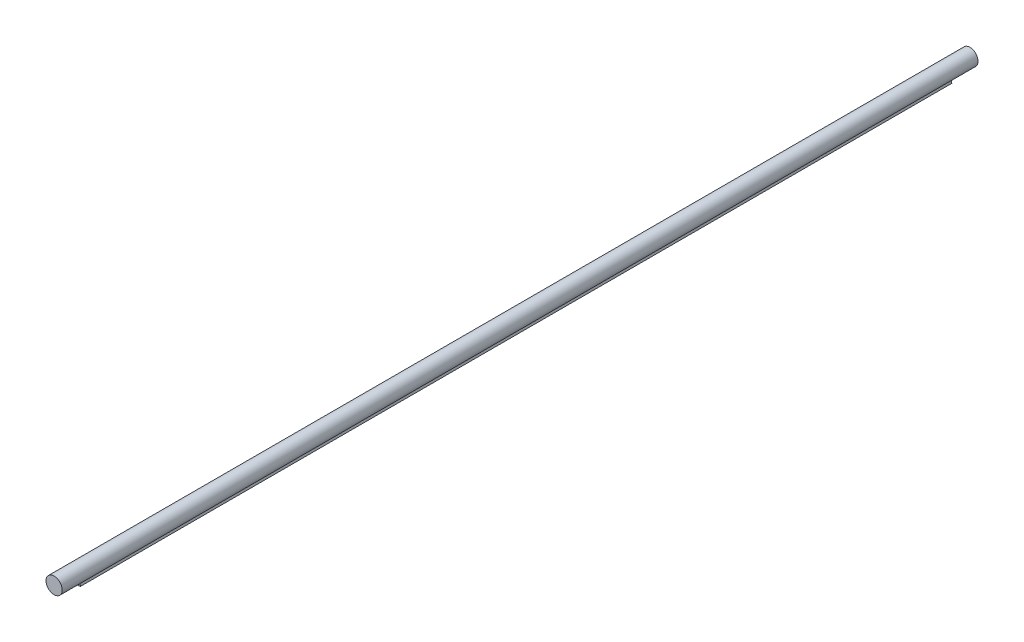
ISO-10303-21;
HEADER;
FILE_DESCRIPTION(('STEP AP214'),'2;1');
FILE_NAME('part.step','',(''),(''),'','','');
FILE_SCHEMA(('AUTOMOTIVE_DESIGN { 1 0 10303 214 1 1 1 1 }'));
ENDSEC;
DATA;
#1=APPLICATION_CONTEXT('core data for automotive mechanical design processes');
#2=APPLICATION_PROTOCOL_DEFINITION('international standard','automotive_design',2000,#1);
#3=PRODUCT_CONTEXT('',#1,'mechanical');
#4=PRODUCT('Part','Part','',(#3));
#5=PRODUCT_RELATED_PRODUCT_CATEGORY('part','',(#4));
#6=PRODUCT_DEFINITION_FORMATION('','',#4);
#7=PRODUCT_DEFINITION_CONTEXT('part definition',#1,'design');
#8=PRODUCT_DEFINITION('design','',#6,#7);
#9=PRODUCT_DEFINITION_SHAPE('','',#8);
#10=(LENGTH_UNIT() NAMED_UNIT(*) SI_UNIT(.MILLI.,.METRE.));
#11=(NAMED_UNIT(*) PLANE_ANGLE_UNIT() SI_UNIT($,.RADIAN.));
#12=(NAMED_UNIT(*) SI_UNIT($,.STERADIAN.) SOLID_ANGLE_UNIT());
#13=UNCERTAINTY_MEASURE_WITH_UNIT(LENGTH_MEASURE(1.E-05),#10,'distance_accuracy_value','');
#14=(GEOMETRIC_REPRESENTATION_CONTEXT(3) GLOBAL_UNCERTAINTY_ASSIGNED_CONTEXT((#13)) GLOBAL_UNIT_ASSIGNED_CONTEXT((#10,
#11,#12)) REPRESENTATION_CONTEXT('',''));
#15=CARTESIAN_POINT('',(0.,0.,0.));
#16=DIRECTION('',(0.,0.,1.));
#17=DIRECTION('',(1.,0.,0.));
#18=AXIS2_PLACEMENT_3D('',#15,#16,#17);
#19=CARTESIAN_POINT('',(2.34925514240952,0.389039636055203,854.446669897988));
#20=DIRECTION('',(0.986563839326466,0.163376225116821,0.));
#21=DIRECTION('',(-0.163376225116821,0.986563839326467,0.));
#22=AXIS2_PLACEMENT_3D('',#19,#20,#21);
#23=PLANE('',#22);
#24=DIRECTION('',(0.,0.,-1.));
#25=VECTOR('',#24,1.);
#26=CARTESIAN_POINT('',(4.03509356533366,-9.79106598099443,854.446669897988));
#27=LINE('',#26,#25);
#28=CARTESIAN_POINT('',(4.03509356528277,-9.79106598100286,808.2359375));
#29=VERTEX_POINT('',#28);
#30=CARTESIAN_POINT('',(4.03509356528277,-9.79106598100286,-46.2359375000004));
#31=VERTEX_POINT('',#30);
#32=EDGE_CURVE('E129',#29,#31,#27,.T.);
#33=ORIENTED_EDGE('',*,*,#32,.T.);
#34=DIRECTION('',(-0.163376225116821,0.986563839326467,0.));
#35=VECTOR('',#34,1.);
#36=CARTESIAN_POINT('',(2.34925514240952,0.389039636055203,-46.2359375000003));
#37=LINE('',#36,#35);
#38=CARTESIAN_POINT('',(3.58632234154447,-7.0811156121409,-46.2359375000004));
#39=VERTEX_POINT('',#38);
#40=EDGE_CURVE('E108',#31,#39,#37,.T.);
#41=ORIENTED_EDGE('',*,*,#40,.T.);
#42=DIRECTION('',(0.,0.,-1.));
#43=VECTOR('',#42,1.);
#44=CARTESIAN_POINT('',(3.58632234154971,-7.08111561215124,854.446669897988));
#45=LINE('',#44,#43);
#46=CARTESIAN_POINT('',(3.58632234154447,-7.0811156121409,808.2359375));
#47=VERTEX_POINT('',#46);
#48=EDGE_CURVE('E13',#47,#39,#45,.T.);
#49=ORIENTED_EDGE('',*,*,#48,.F.);
#50=DIRECTION('',(0.163376225116821,-0.986563839326467,0.));
#51=VECTOR('',#50,1.);
#52=CARTESIAN_POINT('',(2.34925514240952,0.389039636055203,808.2359375));
#53=LINE('',#52,#51);
#54=EDGE_CURVE('E80',#47,#29,#53,.T.);
#55=ORIENTED_EDGE('',*,*,#54,.T.);
#56=EDGE_LOOP('',(#33,#41,#49,#55));
#57=FACE_BOUND('',#56,.T.);
#58=ADVANCED_FACE('F59',(#57),#23,.T.);
#59=CARTESIAN_POINT('',(1.68583842293152,-10.1801056170549,854.446669897988));
#60=DIRECTION('',(0.16337622511682,-0.986563839326467,0.));
#61=DIRECTION('',(0.986563839326467,0.16337622511682,0.));
#62=AXIS2_PLACEMENT_3D('',#59,#60,#61);
#63=PLANE('',#62);
#64=DIRECTION('',(0.,0.,-1.));
#65=VECTOR('',#64,1.);
#66=CARTESIAN_POINT('',(-0.663416719458633,-10.5691452531133,854.446669897988));
#67=LINE('',#66,#65);
#68=CARTESIAN_POINT('',(-0.663416719460579,-10.5691452531016,808.2359375));
#69=VERTEX_POINT('',#68);
#70=CARTESIAN_POINT('',(-0.663416719460579,-10.5691452531016,-46.2359375000004));
#71=VERTEX_POINT('',#70);
#72=EDGE_CURVE('E119',#69,#71,#67,.T.);
#73=ORIENTED_EDGE('',*,*,#72,.T.);
#74=DIRECTION('',(0.986563839326467,0.16337622511682,0.));
#75=VECTOR('',#74,1.);
#76=CARTESIAN_POINT('',(1.68583842293151,-10.1801056170549,-46.2359375000003));
#77=LINE('',#76,#75);
#78=EDGE_CURVE('E102',#71,#31,#77,.T.);
#79=ORIENTED_EDGE('',*,*,#78,.T.);
#80=ORIENTED_EDGE('',*,*,#32,.F.);
#81=DIRECTION('',(-0.986563839326467,-0.16337622511682,0.));
#82=VECTOR('',#81,1.);
#83=CARTESIAN_POINT('',(1.68583842293152,-10.1801056170549,808.2359375));
#84=LINE('',#83,#82);
#85=EDGE_CURVE('E127',#29,#69,#84,.T.);
#86=ORIENTED_EDGE('',*,*,#85,.T.);
#87=EDGE_LOOP('',(#73,#79,#80,#86));
#88=FACE_BOUND('',#87,.T.);
#89=ADVANCED_FACE('F126',(#88),#63,.T.);
#90=CARTESIAN_POINT('',(-2.34925514238277,-0.389039636063656,854.446669897988));
#91=DIRECTION('',(-0.986563839326466,-0.163376225116821,0.));
#92=DIRECTION('',(0.163376225116821,-0.986563839326467,0.));
#93=AXIS2_PLACEMENT_3D('',#90,#91,#92);
#94=PLANE('',#93);
#95=DIRECTION('',(0.,0.,-1.));
#96=VECTOR('',#95,1.);
#97=CARTESIAN_POINT('',(-1.11218794324259,-7.8591948842701,854.446669897988));
#98=LINE('',#97,#96);
#99=CARTESIAN_POINT('',(-1.11218794324259,-7.8591948842701,808.2359375));
#100=VERTEX_POINT('',#99);
#101=CARTESIAN_POINT('',(-1.11218794324097,-7.85919488425862,-46.2359375000004));
#102=VERTEX_POINT('',#101);
#103=EDGE_CURVE('E121',#100,#102,#98,.T.);
#104=ORIENTED_EDGE('',*,*,#103,.T.);
#105=DIRECTION('',(0.163376225116821,-0.986563839326467,0.));
#106=VECTOR('',#105,1.);
#107=CARTESIAN_POINT('',(-2.34925514238277,-0.389039636063656,-46.2359375000003));
#108=LINE('',#107,#106);
#109=EDGE_CURVE('E105',#102,#71,#108,.T.);
#110=ORIENTED_EDGE('',*,*,#109,.T.);
#111=ORIENTED_EDGE('',*,*,#72,.F.);
#112=DIRECTION('',(-0.163376225116821,0.986563839326467,0.));
#113=VECTOR('',#112,1.);
#114=CARTESIAN_POINT('',(-2.34925514238277,-0.389039636063656,808.2359375));
#115=LINE('',#114,#113);
#116=EDGE_CURVE('E148',#69,#100,#115,.T.);
#117=ORIENTED_EDGE('',*,*,#116,.T.);
#118=EDGE_LOOP('',(#104,#110,#111,#117));
#119=FACE_BOUND('',#118,.T.);
#120=ADVANCED_FACE('F118',(#119),#94,.T.);
#121=CARTESIAN_POINT('',(1.33222426146329E-11,-3.88578058618805E-12,-68.0640625000004));
#122=DIRECTION('',(0.,0.,-1.));
#123=DIRECTION('',(-1.,0.,0.));
#124=AXIS2_PLACEMENT_3D('',#121,#122,#123);
#125=PLANE('',#124);
#126=CARTESIAN_POINT('',(1.33222426146329E-11,-3.88578058618805E-12,-68.0640625000004));
#127=DIRECTION('',(0.,0.,-1.));
#128=DIRECTION('',(-1.,0.,0.));
#129=AXIS2_PLACEMENT_3D('',#126,#127,#128);
#130=CIRCLE('',#129,7.9375);
#131=CARTESIAN_POINT('',(-7.93749999998668,-3.88578058618805E-12,-68.0640625000004));
#132=VERTEX_POINT('',#131);
#133=EDGE_CURVE('E136',#132,#132,#130,.T.);
#134=ORIENTED_EDGE('',*,*,#133,.T.);
#135=EDGE_LOOP('',(#134));
#136=FACE_BOUND('',#135,.T.);
#137=ADVANCED_FACE('F168',(#136),#125,.T.);
#138=CARTESIAN_POINT('',(7.39209041200617E-12,-5.21804821573824E-12,830.0640625));
#139=DIRECTION('',(0.,0.,1.));
#140=DIRECTION('',(-0.984726689671445,-0.174107284881242,0.));
#141=AXIS2_PLACEMENT_3D('',#138,#139,#140);
#142=PLANE('',#141);
#143=CARTESIAN_POINT('',(1.33222426146329E-11,-3.88578058618805E-12,830.0640625));
#144=DIRECTION('',(0.,0.,1.));
#145=DIRECTION('',(1.,0.,0.));
#146=AXIS2_PLACEMENT_3D('',#143,#144,#145);
#147=CIRCLE('',#146,7.9375);
#148=CARTESIAN_POINT('',(7.93750000001332,-3.88578058618805E-12,830.0640625));
#149=VERTEX_POINT('',#148);
#150=EDGE_CURVE('E68',#149,#149,#147,.F.);
#151=ORIENTED_EDGE('',*,*,#150,.F.);
#152=EDGE_LOOP('',(#151));
#153=FACE_BOUND('',#152,.T.);
#154=ADVANCED_FACE('F61',(#153),#142,.T.);
#155=CARTESIAN_POINT('',(1.33222426146329E-11,-3.88578058618805E-12,854.446669897988));
#156=DIRECTION('',(0.,0.,-1.));
#157=DIRECTION('',(-1.,0.,0.));
#158=AXIS2_PLACEMENT_3D('',#155,#156,#157);
#159=CYLINDRICAL_SURFACE('',#158,7.9375);
#160=ORIENTED_EDGE('',*,*,#133,.F.);
#161=EDGE_LOOP('',(#160));
#162=FACE_BOUND('',#161,.T.);
#163=ORIENTED_EDGE('',*,*,#48,.T.);
#164=CARTESIAN_POINT('',(1.33221140325965E-11,-3.88474639878076E-12,-46.2359375000004));
#165=DIRECTION('',(0.,0.,-1.));
#166=DIRECTION('',(-1.,0.,0.));
#167=AXIS2_PLACEMENT_3D('',#164,#165,#166);
#168=CIRCLE('',#167,7.93749999998841);
#169=EDGE_CURVE('E123',#102,#39,#168,.F.);
#170=ORIENTED_EDGE('',*,*,#169,.F.);
#171=ORIENTED_EDGE('',*,*,#103,.F.);
#172=CARTESIAN_POINT('',(1.33221140325965E-11,-3.88474639878076E-12,808.2359375));
#173=DIRECTION('',(0.,0.,1.));
#174=DIRECTION('',(1.,0.,0.));
#175=AXIS2_PLACEMENT_3D('',#172,#173,#174);
#176=CIRCLE('',#175,7.93749999998841);
#177=EDGE_CURVE('E75',#47,#100,#176,.F.);
#178=ORIENTED_EDGE('',*,*,#177,.F.);
#179=EDGE_LOOP('',(#163,#170,#171,#178));
#180=FACE_BOUND('',#179,.T.);
#181=ORIENTED_EDGE('',*,*,#150,.T.);
#182=EDGE_LOOP('',(#181));
#183=FACE_BOUND('',#182,.T.);
#184=ADVANCED_FACE('F159',(#162,#180,#183),#159,.T.);
#185=CARTESIAN_POINT('',(7.39209041200617E-12,-5.21804821573824E-12,808.2359375));
#186=DIRECTION('',(0.,0.,1.));
#187=DIRECTION('',(-0.984726689671445,-0.174107284881242,0.));
#188=AXIS2_PLACEMENT_3D('',#185,#186,#187);
#189=PLANE('',#188);
#190=ORIENTED_EDGE('',*,*,#177,.T.);
#191=ORIENTED_EDGE('',*,*,#116,.F.);
#192=ORIENTED_EDGE('',*,*,#85,.F.);
#193=ORIENTED_EDGE('',*,*,#54,.F.);
#194=EDGE_LOOP('',(#190,#191,#192,#193));
#195=FACE_BOUND('',#194,.T.);
#196=ADVANCED_FACE('F162',(#195),#189,.T.);
#197=CARTESIAN_POINT('',(7.39209041200617E-12,-5.21804821573824E-12,-46.2359375000004));
#198=DIRECTION('',(0.,0.,-1.));
#199=DIRECTION('',(0.984726689671445,0.174107284881242,0.));
#200=AXIS2_PLACEMENT_3D('',#197,#198,#199);
#201=PLANE('',#200);
#202=ORIENTED_EDGE('',*,*,#78,.F.);
#203=ORIENTED_EDGE('',*,*,#109,.F.);
#204=ORIENTED_EDGE('',*,*,#169,.T.);
#205=ORIENTED_EDGE('',*,*,#40,.F.);
#206=EDGE_LOOP('',(#202,#203,#204,#205));
#207=FACE_BOUND('',#206,.T.);
#208=ADVANCED_FACE('F104',(#207),#201,.T.);
#209=CLOSED_SHELL('',(#58,#89,#120,#137,#154,#184,#196,#208));
#210=MANIFOLD_SOLID_BREP('B2',#209);
#211=ADVANCED_BREP_SHAPE_REPRESENTATION('',(#18,#210),#14);
#212=SHAPE_DEFINITION_REPRESENTATION(#9,#211);
ENDSEC;
END-ISO-10303-21;
